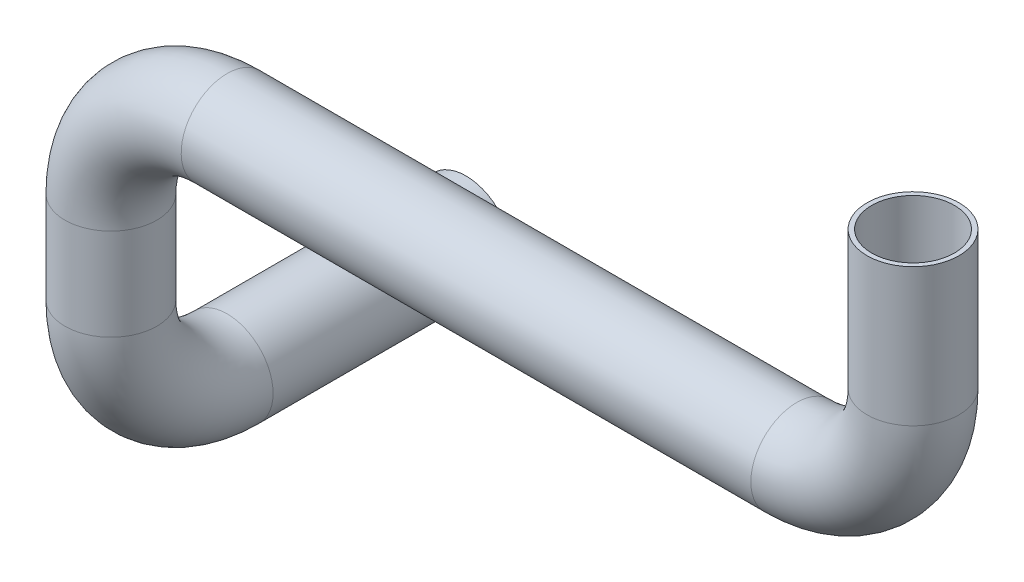
ISO-10303-21;
HEADER;
FILE_DESCRIPTION(('STEP AP214'),'2;1');
FILE_NAME('part.step','',(''),(''),'','','');
FILE_SCHEMA(('AUTOMOTIVE_DESIGN { 1 0 10303 214 1 1 1 1 }'));
ENDSEC;
DATA;
#1=APPLICATION_CONTEXT('core data for automotive mechanical design processes');
#2=APPLICATION_PROTOCOL_DEFINITION('international standard','automotive_design',2000,#1);
#3=PRODUCT_CONTEXT('',#1,'mechanical');
#4=PRODUCT('Part','Part','',(#3));
#5=PRODUCT_RELATED_PRODUCT_CATEGORY('part','',(#4));
#6=PRODUCT_DEFINITION_FORMATION('','',#4);
#7=PRODUCT_DEFINITION_CONTEXT('part definition',#1,'design');
#8=PRODUCT_DEFINITION('design','',#6,#7);
#9=PRODUCT_DEFINITION_SHAPE('','',#8);
#10=(LENGTH_UNIT() NAMED_UNIT(*) SI_UNIT(.MILLI.,.METRE.));
#11=(NAMED_UNIT(*) PLANE_ANGLE_UNIT() SI_UNIT($,.RADIAN.));
#12=(NAMED_UNIT(*) SI_UNIT($,.STERADIAN.) SOLID_ANGLE_UNIT());
#13=UNCERTAINTY_MEASURE_WITH_UNIT(LENGTH_MEASURE(1.E-05),#10,'distance_accuracy_value','');
#14=(GEOMETRIC_REPRESENTATION_CONTEXT(3) GLOBAL_UNCERTAINTY_ASSIGNED_CONTEXT((#13)) GLOBAL_UNIT_ASSIGNED_CONTEXT((#10,
#11,#12)) REPRESENTATION_CONTEXT('',''));
#15=CARTESIAN_POINT('',(0.,0.,0.));
#16=DIRECTION('',(0.,0.,1.));
#17=DIRECTION('',(1.,0.,0.));
#18=AXIS2_PLACEMENT_3D('',#15,#16,#17);
#19=CARTESIAN_POINT('',(87.3,50.3,0.));
#20=DIRECTION('',(0.,1.,0.));
#21=DIRECTION('',(0.,0.,1.));
#22=AXIS2_PLACEMENT_3D('',#19,#20,#21);
#23=PLANE('',#22);
#24=CARTESIAN_POINT('',(87.3,50.3,0.));
#25=DIRECTION('',(0.,1.,0.));
#26=DIRECTION('',(0.,0.,1.));
#27=AXIS2_PLACEMENT_3D('',#24,#25,#26);
#28=CIRCLE('',#27,4.5);
#29=CARTESIAN_POINT('',(87.3,50.3,4.5));
#30=VERTEX_POINT('',#29);
#31=EDGE_CURVE('E61',#30,#30,#28,.T.);
#32=ORIENTED_EDGE('',*,*,#31,.F.);
#33=EDGE_LOOP('',(#32));
#34=FACE_BOUND('',#33,.T.);
#35=CARTESIAN_POINT('',(87.3,50.3,0.));
#36=DIRECTION('',(0.,1.,0.));
#37=DIRECTION('',(0.,0.,1.));
#38=AXIS2_PLACEMENT_3D('',#35,#36,#37);
#39=CIRCLE('',#38,5.);
#40=CARTESIAN_POINT('',(87.3,50.3,5.));
#41=VERTEX_POINT('',#40);
#42=EDGE_CURVE('E10',#41,#41,#39,.T.);
#43=ORIENTED_EDGE('',*,*,#42,.T.);
#44=EDGE_LOOP('',(#43));
#45=FACE_BOUND('',#44,.T.);
#46=ADVANCED_FACE('F30',(#34,#45),#23,.T.);
#47=CARTESIAN_POINT('',(0.,0.,0.));
#48=DIRECTION('',(0.,1.,0.));
#49=DIRECTION('',(0.,0.,1.));
#50=AXIS2_PLACEMENT_3D('',#47,#48,#49);
#51=CYLINDRICAL_SURFACE('',#50,5.);
#52=CARTESIAN_POINT('',(0.,10.,0.));
#53=DIRECTION('',(0.,1.,0.));
#54=DIRECTION('',(0.,0.,1.));
#55=AXIS2_PLACEMENT_3D('',#52,#53,#54);
#56=CIRCLE('',#55,5.);
#57=CARTESIAN_POINT('',(-5.,10.,0.));
#58=VERTEX_POINT('',#57);
#59=EDGE_CURVE('E49',#58,#58,#56,.T.);
#60=ORIENTED_EDGE('',*,*,#59,.F.);
#61=EDGE_LOOP('',(#60));
#62=FACE_BOUND('',#61,.T.);
#63=CARTESIAN_POINT('',(0.,0.,0.));
#64=DIRECTION('',(0.,-1.,0.));
#65=DIRECTION('',(0.,0.,-1.));
#66=AXIS2_PLACEMENT_3D('',#63,#64,#65);
#67=CIRCLE('',#66,5.);
#68=CARTESIAN_POINT('',(0.,0.,5.));
#69=VERTEX_POINT('',#68);
#70=EDGE_CURVE('E58',#69,#69,#67,.T.);
#71=ORIENTED_EDGE('',*,*,#70,.F.);
#72=EDGE_LOOP('',(#71));
#73=FACE_BOUND('',#72,.T.);
#74=ADVANCED_FACE('F127',(#62,#73),#51,.T.);
#75=CARTESIAN_POINT('',(12.65,10.,0.));
#76=DIRECTION('',(0.,0.,-1.));
#77=DIRECTION('',(-1.,0.,0.));
#78=AXIS2_PLACEMENT_3D('',#75,#76,#77);
#79=TOROIDAL_SURFACE('',#78,12.65,5.);
#80=CARTESIAN_POINT('',(12.65,22.65,0.));
#81=DIRECTION('',(1.,0.,0.));
#82=DIRECTION('',(0.,0.,1.));
#83=AXIS2_PLACEMENT_3D('',#80,#81,#82);
#84=CIRCLE('',#83,5.);
#85=CARTESIAN_POINT('',(12.65,27.65,0.));
#86=VERTEX_POINT('',#85);
#87=EDGE_CURVE('E44',#86,#86,#84,.T.);
#88=CARTESIAN_POINT('',(12.65,10.,0.));
#89=DIRECTION('',(0.,0.,-1.));
#90=DIRECTION('',(-1.,0.,0.));
#91=AXIS2_PLACEMENT_3D('',#88,#89,#90);
#92=CIRCLE('',#91,17.65);
#93=EDGE_CURVE('',#58,#86,#92,.T.);
#94=ORIENTED_EDGE('',*,*,#59,.T.);
#95=ORIENTED_EDGE('',*,*,#87,.F.);
#96=ORIENTED_EDGE('',*,*,#93,.T.);
#97=ORIENTED_EDGE('',*,*,#93,.F.);
#98=EDGE_LOOP('',(#94,#96,#95,#97));
#99=FACE_BOUND('',#98,.T.);
#100=ADVANCED_FACE('F123',(#99),#79,.T.);
#101=CARTESIAN_POINT('',(12.65,22.65,0.));
#102=DIRECTION('',(1.,0.,0.));
#103=DIRECTION('',(0.,1.,0.));
#104=AXIS2_PLACEMENT_3D('',#101,#102,#103);
#105=CYLINDRICAL_SURFACE('',#104,5.);
#106=CARTESIAN_POINT('',(74.65,22.65,0.));
#107=DIRECTION('',(1.,0.,0.));
#108=DIRECTION('',(0.,0.,1.));
#109=AXIS2_PLACEMENT_3D('',#106,#107,#108);
#110=CIRCLE('',#109,5.);
#111=CARTESIAN_POINT('',(74.65,17.65,0.));
#112=VERTEX_POINT('',#111);
#113=EDGE_CURVE('E40',#112,#112,#110,.T.);
#114=ORIENTED_EDGE('',*,*,#113,.F.);
#115=EDGE_LOOP('',(#114));
#116=FACE_BOUND('',#115,.T.);
#117=ORIENTED_EDGE('',*,*,#87,.T.);
#118=EDGE_LOOP('',(#117));
#119=FACE_BOUND('',#118,.T.);
#120=ADVANCED_FACE('F117',(#116,#119),#105,.T.);
#121=CARTESIAN_POINT('',(74.65,35.3,0.));
#122=DIRECTION('',(0.,0.,1.));
#123=DIRECTION('',(1.,0.,0.));
#124=AXIS2_PLACEMENT_3D('',#121,#122,#123);
#125=TOROIDAL_SURFACE('',#124,12.65,5.);
#126=CARTESIAN_POINT('',(87.3,35.3,0.));
#127=DIRECTION('',(0.,1.,0.));
#128=DIRECTION('',(0.,0.,1.));
#129=AXIS2_PLACEMENT_3D('',#126,#127,#128);
#130=CIRCLE('',#129,5.);
#131=CARTESIAN_POINT('',(92.3,35.3,0.));
#132=VERTEX_POINT('',#131);
#133=EDGE_CURVE('E36',#132,#132,#130,.T.);
#134=CARTESIAN_POINT('',(74.65,35.3,0.));
#135=DIRECTION('',(0.,0.,1.));
#136=DIRECTION('',(1.,0.,0.));
#137=AXIS2_PLACEMENT_3D('',#134,#135,#136);
#138=CIRCLE('',#137,17.65);
#139=EDGE_CURVE('',#112,#132,#138,.T.);
#140=ORIENTED_EDGE('',*,*,#113,.T.);
#141=ORIENTED_EDGE('',*,*,#133,.F.);
#142=ORIENTED_EDGE('',*,*,#139,.T.);
#143=ORIENTED_EDGE('',*,*,#139,.F.);
#144=EDGE_LOOP('',(#140,#142,#141,#143));
#145=FACE_BOUND('',#144,.T.);
#146=ADVANCED_FACE('F107',(#145),#125,.T.);
#147=CARTESIAN_POINT('',(87.3,35.3,0.));
#148=DIRECTION('',(0.,1.,0.));
#149=DIRECTION('',(0.,0.,1.));
#150=AXIS2_PLACEMENT_3D('',#147,#148,#149);
#151=CYLINDRICAL_SURFACE('',#150,5.);
#152=ORIENTED_EDGE('',*,*,#42,.F.);
#153=EDGE_LOOP('',(#152));
#154=FACE_BOUND('',#153,.T.);
#155=ORIENTED_EDGE('',*,*,#133,.T.);
#156=EDGE_LOOP('',(#155));
#157=FACE_BOUND('',#156,.T.);
#158=ADVANCED_FACE('F104',(#154,#157),#151,.T.);
#159=CARTESIAN_POINT('',(0.,-12.65,-38.65));
#160=DIRECTION('',(0.,0.,-1.));
#161=DIRECTION('',(0.,1.,0.));
#162=AXIS2_PLACEMENT_3D('',#159,#160,#161);
#163=PLANE('',#162);
#164=CARTESIAN_POINT('',(0.,-12.65,-38.65));
#165=DIRECTION('',(0.,0.,-1.));
#166=DIRECTION('',(0.,1.,0.));
#167=AXIS2_PLACEMENT_3D('',#164,#165,#166);
#168=CIRCLE('',#167,4.5);
#169=CARTESIAN_POINT('',(0.,-8.15,-38.65));
#170=VERTEX_POINT('',#169);
#171=EDGE_CURVE('E62',#170,#170,#168,.T.);
#172=ORIENTED_EDGE('',*,*,#171,.F.);
#173=EDGE_LOOP('',(#172));
#174=FACE_BOUND('',#173,.T.);
#175=CARTESIAN_POINT('',(0.,-12.65,-38.65));
#176=DIRECTION('',(0.,0.,-1.));
#177=DIRECTION('',(0.,1.,0.));
#178=AXIS2_PLACEMENT_3D('',#175,#176,#177);
#179=CIRCLE('',#178,5.);
#180=CARTESIAN_POINT('',(0.,-7.65,-38.65));
#181=VERTEX_POINT('',#180);
#182=EDGE_CURVE('E52',#181,#181,#179,.T.);
#183=ORIENTED_EDGE('',*,*,#182,.T.);
#184=EDGE_LOOP('',(#183));
#185=FACE_BOUND('',#184,.T.);
#186=ADVANCED_FACE('F106',(#174,#185),#163,.T.);
#187=CARTESIAN_POINT('',(0.,0.,-12.65));
#188=DIRECTION('',(1.,0.,0.));
#189=DIRECTION('',(0.,0.,-1.));
#190=AXIS2_PLACEMENT_3D('',#187,#188,#189);
#191=TOROIDAL_SURFACE('',#190,12.65,5.);
#192=CARTESIAN_POINT('',(0.,-12.65,-12.65));
#193=DIRECTION('',(0.,0.,-1.));
#194=DIRECTION('',(0.,1.,0.));
#195=AXIS2_PLACEMENT_3D('',#192,#193,#194);
#196=CIRCLE('',#195,5.);
#197=CARTESIAN_POINT('',(0.,-17.65,-12.65));
#198=VERTEX_POINT('',#197);
#199=EDGE_CURVE('E55',#198,#198,#196,.T.);
#200=CARTESIAN_POINT('',(0.,0.,-12.65));
#201=DIRECTION('',(1.,0.,0.));
#202=DIRECTION('',(0.,0.,-1.));
#203=AXIS2_PLACEMENT_3D('',#200,#201,#202);
#204=CIRCLE('',#203,17.65);
#205=EDGE_CURVE('',#69,#198,#204,.T.);
#206=ORIENTED_EDGE('',*,*,#70,.T.);
#207=ORIENTED_EDGE('',*,*,#199,.F.);
#208=ORIENTED_EDGE('',*,*,#205,.T.);
#209=ORIENTED_EDGE('',*,*,#205,.F.);
#210=EDGE_LOOP('',(#206,#208,#207,#209));
#211=FACE_BOUND('',#210,.T.);
#212=ADVANCED_FACE('F113',(#211),#191,.T.);
#213=CARTESIAN_POINT('',(0.,-12.65,-12.65));
#214=DIRECTION('',(0.,0.,-1.));
#215=DIRECTION('',(0.,1.,0.));
#216=AXIS2_PLACEMENT_3D('',#213,#214,#215);
#217=CYLINDRICAL_SURFACE('',#216,5.);
#218=ORIENTED_EDGE('',*,*,#182,.F.);
#219=EDGE_LOOP('',(#218));
#220=FACE_BOUND('',#219,.T.);
#221=ORIENTED_EDGE('',*,*,#199,.T.);
#222=EDGE_LOOP('',(#221));
#223=FACE_BOUND('',#222,.T.);
#224=ADVANCED_FACE('F101',(#220,#223),#217,.T.);
#225=CARTESIAN_POINT('',(0.,0.,0.));
#226=DIRECTION('',(0.,1.,0.));
#227=DIRECTION('',(0.,0.,1.));
#228=AXIS2_PLACEMENT_3D('',#225,#226,#227);
#229=CYLINDRICAL_SURFACE('',#228,4.5);
#230=CARTESIAN_POINT('',(0.,10.,0.));
#231=DIRECTION('',(0.,-1.,0.));
#232=DIRECTION('',(0.,0.,-1.));
#233=AXIS2_PLACEMENT_3D('',#230,#231,#232);
#234=CIRCLE('',#233,4.5);
#235=CARTESIAN_POINT('',(-4.5,10.,0.));
#236=VERTEX_POINT('',#235);
#237=EDGE_CURVE('E65',#236,#236,#234,.F.);
#238=ORIENTED_EDGE('',*,*,#237,.T.);
#239=EDGE_LOOP('',(#238));
#240=FACE_BOUND('',#239,.T.);
#241=CARTESIAN_POINT('',(0.,0.,0.));
#242=DIRECTION('',(0.,1.,0.));
#243=DIRECTION('',(0.,0.,1.));
#244=AXIS2_PLACEMENT_3D('',#241,#242,#243);
#245=CIRCLE('',#244,4.5);
#246=CARTESIAN_POINT('',(0.,0.,4.5));
#247=VERTEX_POINT('',#246);
#248=EDGE_CURVE('E72',#247,#247,#245,.F.);
#249=ORIENTED_EDGE('',*,*,#248,.T.);
#250=EDGE_LOOP('',(#249));
#251=FACE_BOUND('',#250,.T.);
#252=ADVANCED_FACE('F86',(#240,#251),#229,.F.);
#253=CARTESIAN_POINT('',(12.65,10.,0.));
#254=DIRECTION('',(0.,0.,-1.));
#255=DIRECTION('',(-1.,0.,0.));
#256=AXIS2_PLACEMENT_3D('',#253,#254,#255);
#257=TOROIDAL_SURFACE('',#256,12.65,4.5);
#258=CARTESIAN_POINT('',(12.65,22.65,0.));
#259=DIRECTION('',(1.,0.,0.));
#260=DIRECTION('',(0.,1.,0.));
#261=AXIS2_PLACEMENT_3D('',#258,#259,#260);
#262=CIRCLE('',#261,4.5);
#263=CARTESIAN_POINT('',(12.65,27.15,0.));
#264=VERTEX_POINT('',#263);
#265=EDGE_CURVE('E78',#264,#264,#262,.T.);
#266=CARTESIAN_POINT('',(12.65,10.,0.));
#267=DIRECTION('',(0.,0.,-1.));
#268=DIRECTION('',(-1.,0.,0.));
#269=AXIS2_PLACEMENT_3D('',#266,#267,#268);
#270=CIRCLE('',#269,17.15);
#271=EDGE_CURVE('',#236,#264,#270,.T.);
#272=ORIENTED_EDGE('',*,*,#237,.F.);
#273=ORIENTED_EDGE('',*,*,#265,.T.);
#274=ORIENTED_EDGE('',*,*,#271,.T.);
#275=ORIENTED_EDGE('',*,*,#271,.F.);
#276=EDGE_LOOP('',(#272,#274,#273,#275));
#277=FACE_BOUND('',#276,.T.);
#278=ADVANCED_FACE('F89',(#277),#257,.F.);
#279=CARTESIAN_POINT('',(12.65,22.65,0.));
#280=DIRECTION('',(1.,0.,0.));
#281=DIRECTION('',(0.,1.,0.));
#282=AXIS2_PLACEMENT_3D('',#279,#280,#281);
#283=CYLINDRICAL_SURFACE('',#282,4.5);
#284=CARTESIAN_POINT('',(74.65,22.65,0.));
#285=DIRECTION('',(-1.,0.,0.));
#286=DIRECTION('',(0.,-1.,0.));
#287=AXIS2_PLACEMENT_3D('',#284,#285,#286);
#288=CIRCLE('',#287,4.5);
#289=CARTESIAN_POINT('',(74.65,18.15,0.));
#290=VERTEX_POINT('',#289);
#291=EDGE_CURVE('E75',#290,#290,#288,.F.);
#292=ORIENTED_EDGE('',*,*,#291,.T.);
#293=EDGE_LOOP('',(#292));
#294=FACE_BOUND('',#293,.T.);
#295=ORIENTED_EDGE('',*,*,#265,.F.);
#296=EDGE_LOOP('',(#295));
#297=FACE_BOUND('',#296,.T.);
#298=ADVANCED_FACE('F91',(#294,#297),#283,.F.);
#299=CARTESIAN_POINT('',(74.65,35.3,0.));
#300=DIRECTION('',(0.,0.,1.));
#301=DIRECTION('',(1.,0.,0.));
#302=AXIS2_PLACEMENT_3D('',#299,#300,#301);
#303=TOROIDAL_SURFACE('',#302,12.65,4.5);
#304=CARTESIAN_POINT('',(87.3,35.3,0.));
#305=DIRECTION('',(0.,1.,0.));
#306=DIRECTION('',(0.,0.,1.));
#307=AXIS2_PLACEMENT_3D('',#304,#305,#306);
#308=CIRCLE('',#307,4.5);
#309=CARTESIAN_POINT('',(91.8,35.3,0.));
#310=VERTEX_POINT('',#309);
#311=EDGE_CURVE('E69',#310,#310,#308,.T.);
#312=CARTESIAN_POINT('',(74.65,35.3,0.));
#313=DIRECTION('',(0.,0.,1.));
#314=DIRECTION('',(1.,0.,0.));
#315=AXIS2_PLACEMENT_3D('',#312,#313,#314);
#316=CIRCLE('',#315,17.15);
#317=EDGE_CURVE('',#290,#310,#316,.T.);
#318=ORIENTED_EDGE('',*,*,#291,.F.);
#319=ORIENTED_EDGE('',*,*,#311,.T.);
#320=ORIENTED_EDGE('',*,*,#317,.T.);
#321=ORIENTED_EDGE('',*,*,#317,.F.);
#322=EDGE_LOOP('',(#318,#320,#319,#321));
#323=FACE_BOUND('',#322,.T.);
#324=ADVANCED_FACE('F98',(#323),#303,.F.);
#325=CARTESIAN_POINT('',(87.3,35.3,0.));
#326=DIRECTION('',(0.,1.,0.));
#327=DIRECTION('',(0.,0.,1.));
#328=AXIS2_PLACEMENT_3D('',#325,#326,#327);
#329=CYLINDRICAL_SURFACE('',#328,4.5);
#330=ORIENTED_EDGE('',*,*,#31,.T.);
#331=EDGE_LOOP('',(#330));
#332=FACE_BOUND('',#331,.T.);
#333=ORIENTED_EDGE('',*,*,#311,.F.);
#334=EDGE_LOOP('',(#333));
#335=FACE_BOUND('',#334,.T.);
#336=ADVANCED_FACE('F116',(#332,#335),#329,.F.);
#337=CARTESIAN_POINT('',(0.,0.,-12.65));
#338=DIRECTION('',(1.,0.,0.));
#339=DIRECTION('',(0.,0.,-1.));
#340=AXIS2_PLACEMENT_3D('',#337,#338,#339);
#341=TOROIDAL_SURFACE('',#340,12.65,4.5);
#342=CARTESIAN_POINT('',(0.,-12.65,-12.65));
#343=DIRECTION('',(0.,0.,-1.));
#344=DIRECTION('',(0.,1.,0.));
#345=AXIS2_PLACEMENT_3D('',#342,#343,#344);
#346=CIRCLE('',#345,4.5);
#347=CARTESIAN_POINT('',(0.,-17.15,-12.65));
#348=VERTEX_POINT('',#347);
#349=EDGE_CURVE('E66',#348,#348,#346,.T.);
#350=CARTESIAN_POINT('',(0.,0.,-12.65));
#351=DIRECTION('',(1.,0.,0.));
#352=DIRECTION('',(0.,0.,-1.));
#353=AXIS2_PLACEMENT_3D('',#350,#351,#352);
#354=CIRCLE('',#353,17.15);
#355=EDGE_CURVE('',#247,#348,#354,.T.);
#356=ORIENTED_EDGE('',*,*,#248,.F.);
#357=ORIENTED_EDGE('',*,*,#349,.T.);
#358=ORIENTED_EDGE('',*,*,#355,.T.);
#359=ORIENTED_EDGE('',*,*,#355,.F.);
#360=EDGE_LOOP('',(#356,#358,#357,#359));
#361=FACE_BOUND('',#360,.T.);
#362=ADVANCED_FACE('F140',(#361),#341,.F.);
#363=CARTESIAN_POINT('',(0.,-12.65,-12.65));
#364=DIRECTION('',(0.,0.,-1.));
#365=DIRECTION('',(0.,1.,0.));
#366=AXIS2_PLACEMENT_3D('',#363,#364,#365);
#367=CYLINDRICAL_SURFACE('',#366,4.5);
#368=ORIENTED_EDGE('',*,*,#171,.T.);
#369=EDGE_LOOP('',(#368));
#370=FACE_BOUND('',#369,.T.);
#371=ORIENTED_EDGE('',*,*,#349,.F.);
#372=EDGE_LOOP('',(#371));
#373=FACE_BOUND('',#372,.T.);
#374=ADVANCED_FACE('F103',(#370,#373),#367,.F.);
#375=CLOSED_SHELL('',(#46,#74,#100,#120,#146,#158,#186,#212,#224,#252,#278,#298,#324,#336,#362,#374));
#376=MANIFOLD_SOLID_BREP('B2',#375);
#377=ADVANCED_BREP_SHAPE_REPRESENTATION('',(#18,#376),#14);
#378=SHAPE_DEFINITION_REPRESENTATION(#9,#377);
ENDSEC;
END-ISO-10303-21;
